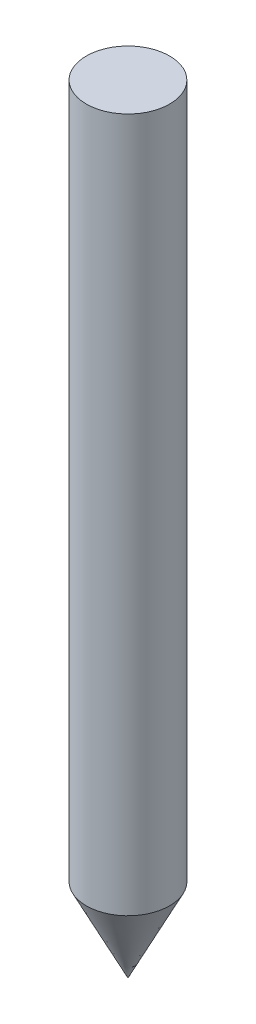
ISO-10303-21;
HEADER;
FILE_DESCRIPTION(('STEP AP214'),'2;1');
FILE_NAME('part.step','',(''),(''),'','','');
FILE_SCHEMA(('AUTOMOTIVE_DESIGN { 1 0 10303 214 1 1 1 1 }'));
ENDSEC;
DATA;
#1=APPLICATION_CONTEXT('core data for automotive mechanical design processes');
#2=APPLICATION_PROTOCOL_DEFINITION('international standard','automotive_design',2000,#1);
#3=PRODUCT_CONTEXT('',#1,'mechanical');
#4=PRODUCT('Part','Part','',(#3));
#5=PRODUCT_RELATED_PRODUCT_CATEGORY('part','',(#4));
#6=PRODUCT_DEFINITION_FORMATION('','',#4);
#7=PRODUCT_DEFINITION_CONTEXT('part definition',#1,'design');
#8=PRODUCT_DEFINITION('design','',#6,#7);
#9=PRODUCT_DEFINITION_SHAPE('','',#8);
#10=(LENGTH_UNIT() NAMED_UNIT(*) SI_UNIT(.MILLI.,.METRE.));
#11=(NAMED_UNIT(*) PLANE_ANGLE_UNIT() SI_UNIT($,.RADIAN.));
#12=(NAMED_UNIT(*) SI_UNIT($,.STERADIAN.) SOLID_ANGLE_UNIT());
#13=UNCERTAINTY_MEASURE_WITH_UNIT(LENGTH_MEASURE(1.E-05),#10,'distance_accuracy_value','');
#14=(GEOMETRIC_REPRESENTATION_CONTEXT(3) GLOBAL_UNCERTAINTY_ASSIGNED_CONTEXT((#13)) GLOBAL_UNIT_ASSIGNED_CONTEXT((#10,
#11,#12)) REPRESENTATION_CONTEXT('',''));
#15=CARTESIAN_POINT('',(0.,0.,0.));
#16=DIRECTION('',(0.,0.,1.));
#17=DIRECTION('',(1.,0.,0.));
#18=AXIS2_PLACEMENT_3D('',#15,#16,#17);
#19=CARTESIAN_POINT('',(0.,56.,0.));
#20=DIRECTION('',(0.,-1.,0.));
#21=DIRECTION('',(0.,0.,-1.));
#22=AXIS2_PLACEMENT_3D('',#19,#20,#21);
#23=CYLINDRICAL_SURFACE('',#22,3.);
#24=CARTESIAN_POINT('',(0.,56.,0.));
#25=DIRECTION('',(0.,1.,0.));
#26=DIRECTION('',(0.,0.,1.));
#27=AXIS2_PLACEMENT_3D('',#24,#25,#26);
#28=CIRCLE('',#27,3.);
#29=CARTESIAN_POINT('',(0.,56.,3.));
#30=VERTEX_POINT('',#29);
#31=EDGE_CURVE('E12',#30,#30,#28,.T.);
#32=ORIENTED_EDGE('',*,*,#31,.F.);
#33=EDGE_LOOP('',(#32));
#34=FACE_BOUND('',#33,.T.);
#35=CARTESIAN_POINT('',(0.,6.,0.));
#36=DIRECTION('',(0.,1.,0.));
#37=DIRECTION('',(0.,0.,1.));
#38=AXIS2_PLACEMENT_3D('',#35,#36,#37);
#39=CIRCLE('',#38,3.);
#40=CARTESIAN_POINT('',(0.,6.,3.));
#41=VERTEX_POINT('',#40);
#42=EDGE_CURVE('E41',#41,#41,#39,.T.);
#43=ORIENTED_EDGE('',*,*,#42,.T.);
#44=EDGE_LOOP('',(#43));
#45=FACE_BOUND('',#44,.T.);
#46=ADVANCED_FACE('F35',(#34,#45),#23,.T.);
#47=CARTESIAN_POINT('',(0.,56.,0.));
#48=DIRECTION('',(0.,1.,0.));
#49=DIRECTION('',(0.,0.,1.));
#50=AXIS2_PLACEMENT_3D('',#47,#48,#49);
#51=PLANE('',#50);
#52=ORIENTED_EDGE('',*,*,#31,.T.);
#53=EDGE_LOOP('',(#52));
#54=FACE_BOUND('',#53,.T.);
#55=ADVANCED_FACE('F46',(#54),#51,.T.);
#56=CARTESIAN_POINT('',(0.,0.,0.));
#57=DIRECTION('',(0.,1.,0.));
#58=DIRECTION('',(0.,0.,1.));
#59=AXIS2_PLACEMENT_3D('',#56,#57,#58);
#60=CONICAL_SURFACE('',#59,0.,0.463647609000806);
#61=ORIENTED_EDGE('',*,*,#42,.F.);
#62=EDGE_LOOP('',(#61));
#63=FACE_BOUND('',#62,.T.);
#64=CARTESIAN_POINT('',(0.,0.,0.));
#65=VERTEX_POINT('',#64);
#66=VERTEX_LOOP('',#65);
#67=FACE_BOUND('',#66,.T.);
#68=ADVANCED_FACE('F44',(#63,#67),#60,.T.);
#69=CLOSED_SHELL('',(#46,#55,#68));
#70=MANIFOLD_SOLID_BREP('B2',#69);
#71=ADVANCED_BREP_SHAPE_REPRESENTATION('',(#18,#70),#14);
#72=SHAPE_DEFINITION_REPRESENTATION(#9,#71);
ENDSEC;
END-ISO-10303-21;
